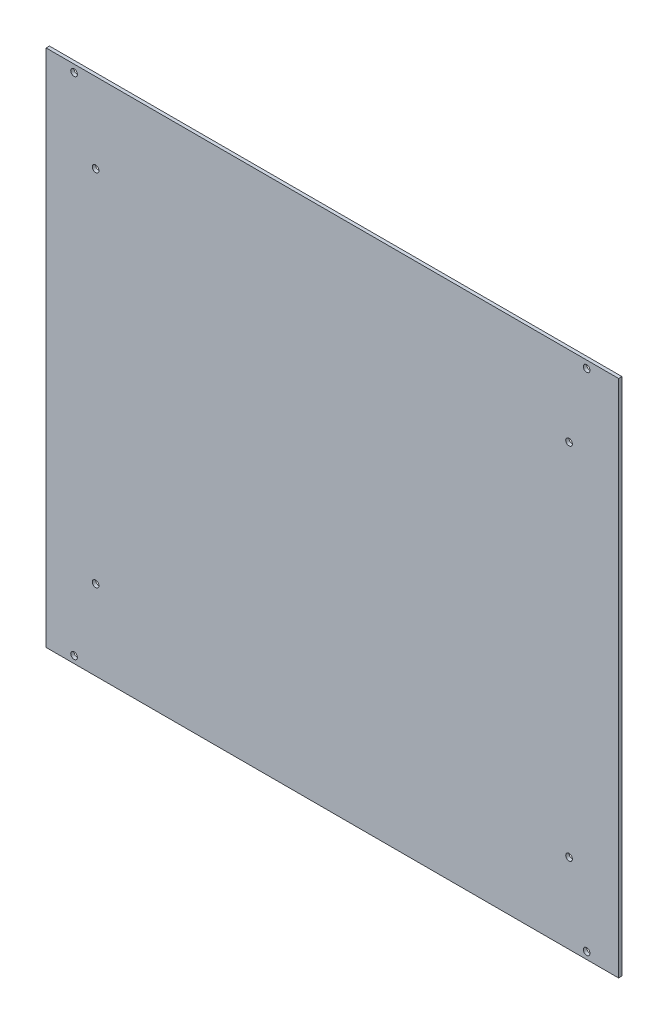
ISO-10303-21;
HEADER;
FILE_DESCRIPTION(('STEP AP214'),'2;1');
FILE_NAME('part.step','',(''),(''),'','','');
FILE_SCHEMA(('AUTOMOTIVE_DESIGN { 1 0 10303 214 1 1 1 1 }'));
ENDSEC;
DATA;
#1=APPLICATION_CONTEXT('core data for automotive mechanical design processes');
#2=APPLICATION_PROTOCOL_DEFINITION('international standard','automotive_design',2000,#1);
#3=PRODUCT_CONTEXT('',#1,'mechanical');
#4=PRODUCT('Part','Part','',(#3));
#5=PRODUCT_RELATED_PRODUCT_CATEGORY('part','',(#4));
#6=PRODUCT_DEFINITION_FORMATION('','',#4);
#7=PRODUCT_DEFINITION_CONTEXT('part definition',#1,'design');
#8=PRODUCT_DEFINITION('design','',#6,#7);
#9=PRODUCT_DEFINITION_SHAPE('','',#8);
#10=(LENGTH_UNIT() NAMED_UNIT(*) SI_UNIT(.MILLI.,.METRE.));
#11=(NAMED_UNIT(*) PLANE_ANGLE_UNIT() SI_UNIT($,.RADIAN.));
#12=(NAMED_UNIT(*) SI_UNIT($,.STERADIAN.) SOLID_ANGLE_UNIT());
#13=UNCERTAINTY_MEASURE_WITH_UNIT(LENGTH_MEASURE(1.E-05),#10,'distance_accuracy_value','');
#14=(GEOMETRIC_REPRESENTATION_CONTEXT(3) GLOBAL_UNCERTAINTY_ASSIGNED_CONTEXT((#13)) GLOBAL_UNIT_ASSIGNED_CONTEXT((#10,
#11,#12)) REPRESENTATION_CONTEXT('',''));
#15=CARTESIAN_POINT('',(0.,0.,0.));
#16=DIRECTION('',(0.,0.,1.));
#17=DIRECTION('',(1.,0.,0.));
#18=AXIS2_PLACEMENT_3D('',#15,#16,#17);
#19=CARTESIAN_POINT('',(0.,0.,3.175));
#20=DIRECTION('',(0.,0.,1.));
#21=DIRECTION('',(1.,0.,0.));
#22=AXIS2_PLACEMENT_3D('',#19,#20,#21);
#23=PLANE('',#22);
#24=CARTESIAN_POINT('',(-246.367218899038,-240.98296569502,3.175));
#25=DIRECTION('',(0.,0.,1.));
#26=DIRECTION('',(1.,0.,0.));
#27=AXIS2_PLACEMENT_3D('',#24,#25,#26);
#28=CIRCLE('',#27,3.17500000000002);
#29=CARTESIAN_POINT('',(-243.192218899038,-240.98296569502,3.175));
#30=VERTEX_POINT('',#29);
#31=EDGE_CURVE('E232',#30,#30,#28,.T.);
#32=ORIENTED_EDGE('',*,*,#31,.F.);
#33=EDGE_LOOP('',(#32));
#34=FACE_BOUND('',#33,.T.);
#35=CARTESIAN_POINT('',(242.582781100962,-240.98296569502,3.175));
#36=DIRECTION('',(0.,0.,1.));
#37=DIRECTION('',(1.,0.,0.));
#38=AXIS2_PLACEMENT_3D('',#35,#36,#37);
#39=CIRCLE('',#38,3.175);
#40=CARTESIAN_POINT('',(245.757781100962,-240.98296569502,3.175));
#41=VERTEX_POINT('',#40);
#42=EDGE_CURVE('E228',#41,#41,#39,.T.);
#43=ORIENTED_EDGE('',*,*,#42,.F.);
#44=EDGE_LOOP('',(#43));
#45=FACE_BOUND('',#44,.T.);
#46=CARTESIAN_POINT('',(242.582781100961,240.65183430498,3.175));
#47=DIRECTION('',(0.,0.,1.));
#48=DIRECTION('',(1.,0.,0.));
#49=AXIS2_PLACEMENT_3D('',#46,#47,#48);
#50=CIRCLE('',#49,3.17500000000002);
#51=CARTESIAN_POINT('',(245.757781100961,240.65183430498,3.175));
#52=VERTEX_POINT('',#51);
#53=EDGE_CURVE('E221',#52,#52,#50,.T.);
#54=ORIENTED_EDGE('',*,*,#53,.F.);
#55=EDGE_LOOP('',(#54));
#56=FACE_BOUND('',#55,.T.);
#57=CARTESIAN_POINT('',(-246.367218899039,240.65183430498,3.175));
#58=DIRECTION('',(0.,0.,1.));
#59=DIRECTION('',(1.,0.,0.));
#60=AXIS2_PLACEMENT_3D('',#57,#58,#59);
#61=CIRCLE('',#60,3.17500000000002);
#62=CARTESIAN_POINT('',(-243.192218899039,240.65183430498,3.175));
#63=VERTEX_POINT('',#62);
#64=EDGE_CURVE('E116',#63,#63,#61,.T.);
#65=ORIENTED_EDGE('',*,*,#64,.F.);
#66=EDGE_LOOP('',(#65));
#67=FACE_BOUND('',#66,.T.);
#68=CARTESIAN_POINT('',(-225.806,-171.45,3.175));
#69=DIRECTION('',(0.,0.,-1.));
#70=DIRECTION('',(-1.,0.,0.));
#71=AXIS2_PLACEMENT_3D('',#68,#69,#70);
#72=CIRCLE('',#71,3.175);
#73=CARTESIAN_POINT('',(-228.981,-171.45,3.175));
#74=VERTEX_POINT('',#73);
#75=EDGE_CURVE('E143',#74,#74,#72,.T.);
#76=ORIENTED_EDGE('',*,*,#75,.T.);
#77=EDGE_LOOP('',(#76));
#78=FACE_BOUND('',#77,.T.);
#79=CARTESIAN_POINT('',(225.806,-171.45,3.175));
#80=DIRECTION('',(0.,0.,1.));
#81=DIRECTION('',(1.,0.,0.));
#82=AXIS2_PLACEMENT_3D('',#79,#80,#81);
#83=CIRCLE('',#82,3.175);
#84=CARTESIAN_POINT('',(228.981,-171.45,3.175));
#85=VERTEX_POINT('',#84);
#86=EDGE_CURVE('E127',#85,#85,#83,.T.);
#87=ORIENTED_EDGE('',*,*,#86,.F.);
#88=EDGE_LOOP('',(#87));
#89=FACE_BOUND('',#88,.T.);
#90=CARTESIAN_POINT('',(-225.806,171.45,3.175));
#91=DIRECTION('',(0.,0.,1.));
#92=DIRECTION('',(1.,0.,0.));
#93=AXIS2_PLACEMENT_3D('',#90,#91,#92);
#94=CIRCLE('',#93,3.175);
#95=CARTESIAN_POINT('',(-222.631,171.45,3.175));
#96=VERTEX_POINT('',#95);
#97=EDGE_CURVE('E139',#96,#96,#94,.T.);
#98=ORIENTED_EDGE('',*,*,#97,.F.);
#99=EDGE_LOOP('',(#98));
#100=FACE_BOUND('',#99,.T.);
#101=DIRECTION('',(1.,0.,0.));
#102=VECTOR('',#101,1.);
#103=CARTESIAN_POINT('',(-273.05,247.65,3.175));
#104=LINE('',#103,#102);
#105=CARTESIAN_POINT('',(-273.05,247.65,3.175));
#106=VERTEX_POINT('',#105);
#107=CARTESIAN_POINT('',(273.05,247.65,3.175));
#108=VERTEX_POINT('',#107);
#109=EDGE_CURVE('E94',#106,#108,#104,.T.);
#110=ORIENTED_EDGE('',*,*,#109,.F.);
#111=DIRECTION('',(0.,1.,0.));
#112=VECTOR('',#111,1.);
#113=CARTESIAN_POINT('',(-273.05,-247.65,3.175));
#114=LINE('',#113,#112);
#115=CARTESIAN_POINT('',(-273.05,-247.65,3.175));
#116=VERTEX_POINT('',#115);
#117=EDGE_CURVE('E82',#116,#106,#114,.T.);
#118=ORIENTED_EDGE('',*,*,#117,.F.);
#119=DIRECTION('',(1.,0.,0.));
#120=VECTOR('',#119,1.);
#121=CARTESIAN_POINT('',(-273.05,-247.65,3.175));
#122=LINE('',#121,#120);
#123=CARTESIAN_POINT('',(273.05,-247.65,3.175));
#124=VERTEX_POINT('',#123);
#125=EDGE_CURVE('E79',#116,#124,#122,.T.);
#126=ORIENTED_EDGE('',*,*,#125,.T.);
#127=DIRECTION('',(0.,1.,0.));
#128=VECTOR('',#127,1.);
#129=CARTESIAN_POINT('',(273.05,-247.65,3.175));
#130=LINE('',#129,#128);
#131=EDGE_CURVE('E76',#124,#108,#130,.T.);
#132=ORIENTED_EDGE('',*,*,#131,.T.);
#133=EDGE_LOOP('',(#110,#118,#126,#132));
#134=FACE_BOUND('',#133,.T.);
#135=CARTESIAN_POINT('',(225.806,171.45,3.175));
#136=DIRECTION('',(0.,0.,-1.));
#137=DIRECTION('',(-1.,0.,0.));
#138=AXIS2_PLACEMENT_3D('',#135,#136,#137);
#139=CIRCLE('',#138,3.175);
#140=CARTESIAN_POINT('',(222.631,171.45,3.175));
#141=VERTEX_POINT('',#140);
#142=EDGE_CURVE('E136',#141,#141,#139,.T.);
#143=ORIENTED_EDGE('',*,*,#142,.T.);
#144=EDGE_LOOP('',(#143));
#145=FACE_BOUND('',#144,.T.);
#146=ADVANCED_FACE('F33',(#34,#45,#56,#67,#78,#89,#100,#134,#145),#23,.T.);
#147=CARTESIAN_POINT('',(0.,0.,0.));
#148=DIRECTION('',(0.,0.,1.));
#149=DIRECTION('',(1.,0.,0.));
#150=AXIS2_PLACEMENT_3D('',#147,#148,#149);
#151=PLANE('',#150);
#152=CARTESIAN_POINT('',(-246.367218899038,-240.98296569502,0.));
#153=DIRECTION('',(0.,0.,1.));
#154=DIRECTION('',(1.,0.,0.));
#155=AXIS2_PLACEMENT_3D('',#152,#153,#154);
#156=CIRCLE('',#155,3.17500000000002);
#157=CARTESIAN_POINT('',(-243.192218899038,-240.98296569502,0.));
#158=VERTEX_POINT('',#157);
#159=EDGE_CURVE('E37',#158,#158,#156,.T.);
#160=ORIENTED_EDGE('',*,*,#159,.T.);
#161=EDGE_LOOP('',(#160));
#162=FACE_BOUND('',#161,.T.);
#163=CARTESIAN_POINT('',(242.582781100962,-240.98296569502,0.));
#164=DIRECTION('',(0.,0.,1.));
#165=DIRECTION('',(1.,0.,0.));
#166=AXIS2_PLACEMENT_3D('',#163,#164,#165);
#167=CIRCLE('',#166,3.175);
#168=CARTESIAN_POINT('',(245.757781100962,-240.98296569502,0.));
#169=VERTEX_POINT('',#168);
#170=EDGE_CURVE('E118',#169,#169,#167,.T.);
#171=ORIENTED_EDGE('',*,*,#170,.T.);
#172=EDGE_LOOP('',(#171));
#173=FACE_BOUND('',#172,.T.);
#174=CARTESIAN_POINT('',(242.582781100961,240.65183430498,0.));
#175=DIRECTION('',(0.,0.,1.));
#176=DIRECTION('',(1.,0.,0.));
#177=AXIS2_PLACEMENT_3D('',#174,#175,#176);
#178=CIRCLE('',#177,3.17500000000002);
#179=CARTESIAN_POINT('',(245.757781100961,240.65183430498,0.));
#180=VERTEX_POINT('',#179);
#181=EDGE_CURVE('E115',#180,#180,#178,.T.);
#182=ORIENTED_EDGE('',*,*,#181,.T.);
#183=EDGE_LOOP('',(#182));
#184=FACE_BOUND('',#183,.T.);
#185=CARTESIAN_POINT('',(-246.367218899039,240.65183430498,0.));
#186=DIRECTION('',(0.,0.,1.));
#187=DIRECTION('',(1.,0.,0.));
#188=AXIS2_PLACEMENT_3D('',#185,#186,#187);
#189=CIRCLE('',#188,3.17500000000002);
#190=CARTESIAN_POINT('',(-243.192218899039,240.65183430498,0.));
#191=VERTEX_POINT('',#190);
#192=EDGE_CURVE('E112',#191,#191,#189,.T.);
#193=ORIENTED_EDGE('',*,*,#192,.T.);
#194=EDGE_LOOP('',(#193));
#195=FACE_BOUND('',#194,.T.);
#196=CARTESIAN_POINT('',(225.806,-171.45,0.));
#197=DIRECTION('',(0.,0.,1.));
#198=DIRECTION('',(1.,0.,0.));
#199=AXIS2_PLACEMENT_3D('',#196,#197,#198);
#200=CIRCLE('',#199,3.175);
#201=CARTESIAN_POINT('',(228.981,-171.45,0.));
#202=VERTEX_POINT('',#201);
#203=EDGE_CURVE('E123',#202,#202,#200,.T.);
#204=ORIENTED_EDGE('',*,*,#203,.T.);
#205=EDGE_LOOP('',(#204));
#206=FACE_BOUND('',#205,.T.);
#207=CARTESIAN_POINT('',(-225.806,171.45,0.));
#208=DIRECTION('',(0.,0.,1.));
#209=DIRECTION('',(1.,0.,0.));
#210=AXIS2_PLACEMENT_3D('',#207,#208,#209);
#211=CIRCLE('',#210,3.175);
#212=CARTESIAN_POINT('',(-222.631,171.45,0.));
#213=VERTEX_POINT('',#212);
#214=EDGE_CURVE('E105',#213,#213,#211,.T.);
#215=ORIENTED_EDGE('',*,*,#214,.T.);
#216=EDGE_LOOP('',(#215));
#217=FACE_BOUND('',#216,.T.);
#218=DIRECTION('',(1.,0.,0.));
#219=VECTOR('',#218,1.);
#220=CARTESIAN_POINT('',(-273.05,247.65,0.));
#221=LINE('',#220,#219);
#222=CARTESIAN_POINT('',(-273.05,247.65,0.));
#223=VERTEX_POINT('',#222);
#224=CARTESIAN_POINT('',(273.05,247.65,0.));
#225=VERTEX_POINT('',#224);
#226=EDGE_CURVE('E101',#223,#225,#221,.T.);
#227=ORIENTED_EDGE('',*,*,#226,.T.);
#228=DIRECTION('',(0.,1.,0.));
#229=VECTOR('',#228,1.);
#230=CARTESIAN_POINT('',(273.05,-247.65,0.));
#231=LINE('',#230,#229);
#232=CARTESIAN_POINT('',(273.05,-247.65,0.));
#233=VERTEX_POINT('',#232);
#234=EDGE_CURVE('E104',#233,#225,#231,.T.);
#235=ORIENTED_EDGE('',*,*,#234,.F.);
#236=DIRECTION('',(1.,0.,0.));
#237=VECTOR('',#236,1.);
#238=CARTESIAN_POINT('',(-273.05,-247.65,0.));
#239=LINE('',#238,#237);
#240=CARTESIAN_POINT('',(-273.05,-247.65,0.));
#241=VERTEX_POINT('',#240);
#242=EDGE_CURVE('E87',#241,#233,#239,.T.);
#243=ORIENTED_EDGE('',*,*,#242,.F.);
#244=DIRECTION('',(0.,1.,0.));
#245=VECTOR('',#244,1.);
#246=CARTESIAN_POINT('',(-273.05,-247.65,0.));
#247=LINE('',#246,#245);
#248=EDGE_CURVE('E96',#241,#223,#247,.T.);
#249=ORIENTED_EDGE('',*,*,#248,.T.);
#250=EDGE_LOOP('',(#227,#235,#243,#249));
#251=FACE_BOUND('',#250,.T.);
#252=CARTESIAN_POINT('',(-225.806,-171.45,0.));
#253=DIRECTION('',(0.,0.,-1.));
#254=DIRECTION('',(-1.,0.,0.));
#255=AXIS2_PLACEMENT_3D('',#252,#253,#254);
#256=CIRCLE('',#255,3.175);
#257=CARTESIAN_POINT('',(-228.981,-171.45,0.));
#258=VERTEX_POINT('',#257);
#259=EDGE_CURVE('E132',#258,#258,#256,.T.);
#260=ORIENTED_EDGE('',*,*,#259,.F.);
#261=EDGE_LOOP('',(#260));
#262=FACE_BOUND('',#261,.T.);
#263=CARTESIAN_POINT('',(225.806,171.45,0.));
#264=DIRECTION('',(0.,0.,-1.));
#265=DIRECTION('',(-1.,0.,0.));
#266=AXIS2_PLACEMENT_3D('',#263,#264,#265);
#267=CIRCLE('',#266,3.175);
#268=CARTESIAN_POINT('',(222.631,171.45,0.));
#269=VERTEX_POINT('',#268);
#270=EDGE_CURVE('E140',#269,#269,#267,.T.);
#271=ORIENTED_EDGE('',*,*,#270,.F.);
#272=EDGE_LOOP('',(#271));
#273=FACE_BOUND('',#272,.T.);
#274=ADVANCED_FACE('F155',(#162,#173,#184,#195,#206,#217,#251,#262,#273),#151,.F.);
#275=CARTESIAN_POINT('',(-273.05,247.65,3.175));
#276=DIRECTION('',(0.,1.,0.));
#277=DIRECTION('',(0.,0.,1.));
#278=AXIS2_PLACEMENT_3D('',#275,#276,#277);
#279=PLANE('',#278);
#280=ORIENTED_EDGE('',*,*,#226,.F.);
#281=DIRECTION('',(0.,0.,-1.));
#282=VECTOR('',#281,1.);
#283=CARTESIAN_POINT('',(-273.05,247.65,3.175));
#284=LINE('',#283,#282);
#285=EDGE_CURVE('E11',#106,#223,#284,.T.);
#286=ORIENTED_EDGE('',*,*,#285,.F.);
#287=ORIENTED_EDGE('',*,*,#109,.T.);
#288=DIRECTION('',(0.,0.,-1.));
#289=VECTOR('',#288,1.);
#290=CARTESIAN_POINT('',(273.05,247.65,3.175));
#291=LINE('',#290,#289);
#292=EDGE_CURVE('E91',#108,#225,#291,.T.);
#293=ORIENTED_EDGE('',*,*,#292,.T.);
#294=EDGE_LOOP('',(#280,#286,#287,#293));
#295=FACE_BOUND('',#294,.T.);
#296=ADVANCED_FACE('F35',(#295),#279,.T.);
#297=CARTESIAN_POINT('',(-273.05,-247.65,3.175));
#298=DIRECTION('',(-1.,0.,0.));
#299=DIRECTION('',(0.,0.,1.));
#300=AXIS2_PLACEMENT_3D('',#297,#298,#299);
#301=PLANE('',#300);
#302=ORIENTED_EDGE('',*,*,#248,.F.);
#303=DIRECTION('',(0.,0.,-1.));
#304=VECTOR('',#303,1.);
#305=CARTESIAN_POINT('',(-273.05,-247.65,3.175));
#306=LINE('',#305,#304);
#307=EDGE_CURVE('E43',#116,#241,#306,.T.);
#308=ORIENTED_EDGE('',*,*,#307,.F.);
#309=ORIENTED_EDGE('',*,*,#117,.T.);
#310=ORIENTED_EDGE('',*,*,#285,.T.);
#311=EDGE_LOOP('',(#302,#308,#309,#310));
#312=FACE_BOUND('',#311,.T.);
#313=ADVANCED_FACE('F167',(#312),#301,.T.);
#314=CARTESIAN_POINT('',(-273.05,-247.65,3.175));
#315=DIRECTION('',(0.,1.,0.));
#316=DIRECTION('',(0.,0.,1.));
#317=AXIS2_PLACEMENT_3D('',#314,#315,#316);
#318=PLANE('',#317);
#319=ORIENTED_EDGE('',*,*,#242,.T.);
#320=DIRECTION('',(0.,0.,-1.));
#321=VECTOR('',#320,1.);
#322=CARTESIAN_POINT('',(273.05,-247.65,3.175));
#323=LINE('',#322,#321);
#324=EDGE_CURVE('E85',#124,#233,#323,.T.);
#325=ORIENTED_EDGE('',*,*,#324,.F.);
#326=ORIENTED_EDGE('',*,*,#125,.F.);
#327=ORIENTED_EDGE('',*,*,#307,.T.);
#328=EDGE_LOOP('',(#319,#325,#326,#327));
#329=FACE_BOUND('',#328,.T.);
#330=ADVANCED_FACE('F86',(#329),#318,.F.);
#331=CARTESIAN_POINT('',(273.05,-247.65,3.175));
#332=DIRECTION('',(-1.,0.,0.));
#333=DIRECTION('',(0.,0.,1.));
#334=AXIS2_PLACEMENT_3D('',#331,#332,#333);
#335=PLANE('',#334);
#336=ORIENTED_EDGE('',*,*,#234,.T.);
#337=ORIENTED_EDGE('',*,*,#292,.F.);
#338=ORIENTED_EDGE('',*,*,#131,.F.);
#339=ORIENTED_EDGE('',*,*,#324,.T.);
#340=EDGE_LOOP('',(#336,#337,#338,#339));
#341=FACE_BOUND('',#340,.T.);
#342=ADVANCED_FACE('F93',(#341),#335,.F.);
#343=CARTESIAN_POINT('',(-225.806,171.45,0.));
#344=DIRECTION('',(0.,0.,1.));
#345=DIRECTION('',(1.,0.,0.));
#346=AXIS2_PLACEMENT_3D('',#343,#344,#345);
#347=CYLINDRICAL_SURFACE('',#346,3.175);
#348=ORIENTED_EDGE('',*,*,#214,.F.);
#349=EDGE_LOOP('',(#348));
#350=FACE_BOUND('',#349,.T.);
#351=ORIENTED_EDGE('',*,*,#97,.T.);
#352=EDGE_LOOP('',(#351));
#353=FACE_BOUND('',#352,.T.);
#354=ADVANCED_FACE('F152',(#350,#353),#347,.F.);
#355=CARTESIAN_POINT('',(225.806,-171.45,0.));
#356=DIRECTION('',(0.,0.,1.));
#357=DIRECTION('',(1.,0.,0.));
#358=AXIS2_PLACEMENT_3D('',#355,#356,#357);
#359=CYLINDRICAL_SURFACE('',#358,3.175);
#360=ORIENTED_EDGE('',*,*,#203,.F.);
#361=EDGE_LOOP('',(#360));
#362=FACE_BOUND('',#361,.T.);
#363=ORIENTED_EDGE('',*,*,#86,.T.);
#364=EDGE_LOOP('',(#363));
#365=FACE_BOUND('',#364,.T.);
#366=ADVANCED_FACE('F175',(#362,#365),#359,.F.);
#367=CARTESIAN_POINT('',(-225.806,-171.45,0.));
#368=DIRECTION('',(0.,0.,1.));
#369=DIRECTION('',(1.,0.,0.));
#370=AXIS2_PLACEMENT_3D('',#367,#368,#369);
#371=CYLINDRICAL_SURFACE('',#370,3.175);
#372=ORIENTED_EDGE('',*,*,#259,.T.);
#373=EDGE_LOOP('',(#372));
#374=FACE_BOUND('',#373,.T.);
#375=ORIENTED_EDGE('',*,*,#75,.F.);
#376=EDGE_LOOP('',(#375));
#377=FACE_BOUND('',#376,.T.);
#378=ADVANCED_FACE('F180',(#374,#377),#371,.F.);
#379=CARTESIAN_POINT('',(225.806,171.45,0.));
#380=DIRECTION('',(0.,0.,1.));
#381=DIRECTION('',(1.,0.,0.));
#382=AXIS2_PLACEMENT_3D('',#379,#380,#381);
#383=CYLINDRICAL_SURFACE('',#382,3.175);
#384=ORIENTED_EDGE('',*,*,#270,.T.);
#385=EDGE_LOOP('',(#384));
#386=FACE_BOUND('',#385,.T.);
#387=ORIENTED_EDGE('',*,*,#142,.F.);
#388=EDGE_LOOP('',(#387));
#389=FACE_BOUND('',#388,.T.);
#390=ADVANCED_FACE('F191',(#386,#389),#383,.F.);
#391=CARTESIAN_POINT('',(-246.367218899039,240.65183430498,-13.589));
#392=DIRECTION('',(0.,0.,1.));
#393=DIRECTION('',(1.,0.,0.));
#394=AXIS2_PLACEMENT_3D('',#391,#392,#393);
#395=CYLINDRICAL_SURFACE('',#394,3.17500000000002);
#396=ORIENTED_EDGE('',*,*,#64,.T.);
#397=EDGE_LOOP('',(#396));
#398=FACE_BOUND('',#397,.T.);
#399=ORIENTED_EDGE('',*,*,#192,.F.);
#400=EDGE_LOOP('',(#399));
#401=FACE_BOUND('',#400,.T.);
#402=ADVANCED_FACE('F194',(#398,#401),#395,.F.);
#403=CARTESIAN_POINT('',(242.582781100961,240.65183430498,-13.589));
#404=DIRECTION('',(0.,0.,1.));
#405=DIRECTION('',(1.,0.,0.));
#406=AXIS2_PLACEMENT_3D('',#403,#404,#405);
#407=CYLINDRICAL_SURFACE('',#406,3.17500000000002);
#408=ORIENTED_EDGE('',*,*,#53,.T.);
#409=EDGE_LOOP('',(#408));
#410=FACE_BOUND('',#409,.T.);
#411=ORIENTED_EDGE('',*,*,#181,.F.);
#412=EDGE_LOOP('',(#411));
#413=FACE_BOUND('',#412,.T.);
#414=ADVANCED_FACE('F201',(#410,#413),#407,.F.);
#415=CARTESIAN_POINT('',(242.582781100962,-240.98296569502,-13.589));
#416=DIRECTION('',(0.,0.,1.));
#417=DIRECTION('',(1.,0.,0.));
#418=AXIS2_PLACEMENT_3D('',#415,#416,#417);
#419=CYLINDRICAL_SURFACE('',#418,3.175);
#420=ORIENTED_EDGE('',*,*,#42,.T.);
#421=EDGE_LOOP('',(#420));
#422=FACE_BOUND('',#421,.T.);
#423=ORIENTED_EDGE('',*,*,#170,.F.);
#424=EDGE_LOOP('',(#423));
#425=FACE_BOUND('',#424,.T.);
#426=ADVANCED_FACE('F209',(#422,#425),#419,.F.);
#427=CARTESIAN_POINT('',(-246.367218899038,-240.98296569502,-13.589));
#428=DIRECTION('',(0.,0.,1.));
#429=DIRECTION('',(1.,0.,0.));
#430=AXIS2_PLACEMENT_3D('',#427,#428,#429);
#431=CYLINDRICAL_SURFACE('',#430,3.17500000000002);
#432=ORIENTED_EDGE('',*,*,#31,.T.);
#433=EDGE_LOOP('',(#432));
#434=FACE_BOUND('',#433,.T.);
#435=ORIENTED_EDGE('',*,*,#159,.F.);
#436=EDGE_LOOP('',(#435));
#437=FACE_BOUND('',#436,.T.);
#438=ADVANCED_FACE('F206',(#434,#437),#431,.F.);
#439=CLOSED_SHELL('',(#146,#274,#296,#313,#330,#342,#354,#366,#378,#390,#402,#414,#426,#438));
#440=MANIFOLD_SOLID_BREP('B2',#439);
#441=ADVANCED_BREP_SHAPE_REPRESENTATION('',(#18,#440),#14);
#442=SHAPE_DEFINITION_REPRESENTATION(#9,#441);
ENDSEC;
END-ISO-10303-21;
